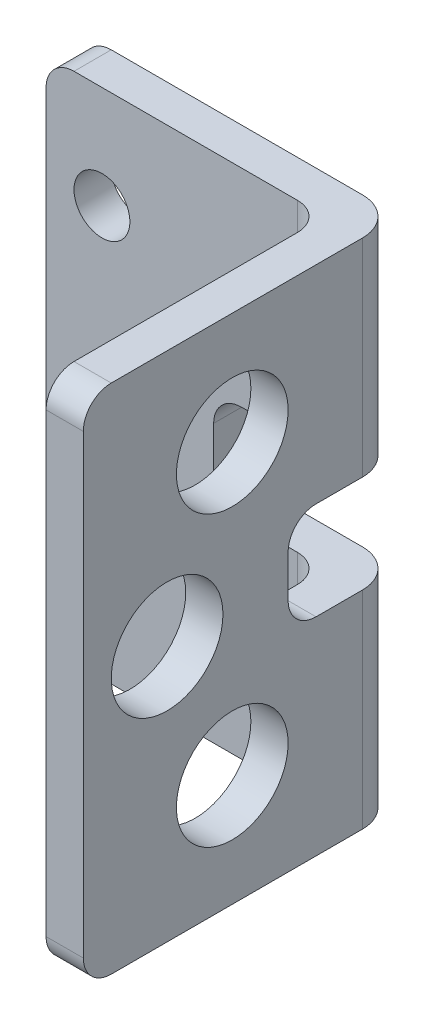
ISO-10303-21;
HEADER;
FILE_DESCRIPTION(('STEP AP214'),'2;1');
FILE_NAME('part.step','',(''),(''),'','','');
FILE_SCHEMA(('AUTOMOTIVE_DESIGN { 1 0 10303 214 1 1 1 1 }'));
ENDSEC;
DATA;
#1=APPLICATION_CONTEXT('core data for automotive mechanical design processes');
#2=APPLICATION_PROTOCOL_DEFINITION('international standard','automotive_design',2000,#1);
#3=PRODUCT_CONTEXT('',#1,'mechanical');
#4=PRODUCT('Part','Part','',(#3));
#5=PRODUCT_RELATED_PRODUCT_CATEGORY('part','',(#4));
#6=PRODUCT_DEFINITION_FORMATION('','',#4);
#7=PRODUCT_DEFINITION_CONTEXT('part definition',#1,'design');
#8=PRODUCT_DEFINITION('design','',#6,#7);
#9=PRODUCT_DEFINITION_SHAPE('','',#8);
#10=(LENGTH_UNIT() NAMED_UNIT(*) SI_UNIT(.MILLI.,.METRE.));
#11=(NAMED_UNIT(*) PLANE_ANGLE_UNIT() SI_UNIT($,.RADIAN.));
#12=(NAMED_UNIT(*) SI_UNIT($,.STERADIAN.) SOLID_ANGLE_UNIT());
#13=UNCERTAINTY_MEASURE_WITH_UNIT(LENGTH_MEASURE(1.E-05),#10,'distance_accuracy_value','');
#14=(GEOMETRIC_REPRESENTATION_CONTEXT(3) GLOBAL_UNCERTAINTY_ASSIGNED_CONTEXT((#13)) GLOBAL_UNIT_ASSIGNED_CONTEXT((#10,
#11,#12)) REPRESENTATION_CONTEXT('',''));
#15=CARTESIAN_POINT('',(0.,0.,0.));
#16=DIRECTION('',(0.,0.,1.));
#17=DIRECTION('',(1.,0.,0.));
#18=AXIS2_PLACEMENT_3D('',#15,#16,#17);
#19=CARTESIAN_POINT('',(15.,27.5,0.));
#20=DIRECTION('',(0.,-1.,0.));
#21=DIRECTION('',(0.,0.,-1.));
#22=AXIS2_PLACEMENT_3D('',#19,#20,#21);
#23=CYLINDRICAL_SURFACE('',#22,1.99999999999999);
#24=DIRECTION('',(0.,-1.,0.));
#25=VECTOR('',#24,1.);
#26=CARTESIAN_POINT('',(17.,27.5,0.));
#27=LINE('',#26,#25);
#28=CARTESIAN_POINT('',(17.,27.5,0.));
#29=VERTEX_POINT('',#28);
#30=CARTESIAN_POINT('',(17.,16.375,0.));
#31=VERTEX_POINT('',#30);
#32=EDGE_CURVE('E233',#29,#31,#27,.T.);
#33=ORIENTED_EDGE('',*,*,#32,.T.);
#34=CARTESIAN_POINT('',(15.,16.375,0.));
#35=DIRECTION('',(0.,1.,0.));
#36=DIRECTION('',(0.,0.,1.));
#37=AXIS2_PLACEMENT_3D('',#34,#35,#36);
#38=CIRCLE('',#37,1.99999999999999);
#39=CARTESIAN_POINT('',(15.,16.375,-2.));
#40=VERTEX_POINT('',#39);
#41=EDGE_CURVE('E346',#31,#40,#38,.T.);
#42=ORIENTED_EDGE('',*,*,#41,.T.);
#43=DIRECTION('',(0.,-1.,0.));
#44=VECTOR('',#43,1.);
#45=CARTESIAN_POINT('',(15.,27.5,-2.));
#46=LINE('',#45,#44);
#47=CARTESIAN_POINT('',(15.,27.5,-2.));
#48=VERTEX_POINT('',#47);
#49=EDGE_CURVE('E223',#48,#40,#46,.T.);
#50=ORIENTED_EDGE('',*,*,#49,.F.);
#51=CARTESIAN_POINT('',(15.,27.5,0.));
#52=DIRECTION('',(0.,1.,0.));
#53=DIRECTION('',(0.,0.,-1.));
#54=AXIS2_PLACEMENT_3D('',#51,#52,#53);
#55=CIRCLE('',#54,1.99999999999999);
#56=EDGE_CURVE('E390',#29,#48,#55,.T.);
#57=ORIENTED_EDGE('',*,*,#56,.F.);
#58=EDGE_LOOP('',(#33,#42,#50,#57));
#59=FACE_BOUND('',#58,.T.);
#60=ADVANCED_FACE('F36',(#59),#23,.T.);
#61=CARTESIAN_POINT('',(0.,27.5,0.));
#62=DIRECTION('',(1.,0.,0.));
#63=DIRECTION('',(0.,0.,-1.));
#64=AXIS2_PLACEMENT_3D('',#61,#62,#63);
#65=PLANE('',#64);
#66=DIRECTION('',(0.,-1.,0.));
#67=VECTOR('',#66,1.);
#68=CARTESIAN_POINT('',(0.,27.5,-2.));
#69=LINE('',#68,#67);
#70=CARTESIAN_POINT('',(0.,26.,-2.));
#71=VERTEX_POINT('',#70);
#72=CARTESIAN_POINT('',(0.,1.5,-2.));
#73=VERTEX_POINT('',#72);
#74=EDGE_CURVE('E224',#71,#73,#69,.T.);
#75=ORIENTED_EDGE('',*,*,#74,.T.);
#76=DIRECTION('',(0.,0.,1.));
#77=VECTOR('',#76,1.);
#78=CARTESIAN_POINT('',(0.,1.5,0.));
#79=LINE('',#78,#77);
#80=CARTESIAN_POINT('',(0.,1.5,0.));
#81=VERTEX_POINT('',#80);
#82=EDGE_CURVE('E278',#73,#81,#79,.T.);
#83=ORIENTED_EDGE('',*,*,#82,.T.);
#84=DIRECTION('',(0.,-1.,0.));
#85=VECTOR('',#84,1.);
#86=CARTESIAN_POINT('',(0.,27.5,0.));
#87=LINE('',#86,#85);
#88=CARTESIAN_POINT('',(0.,26.,0.));
#89=VERTEX_POINT('',#88);
#90=EDGE_CURVE('E242',#89,#81,#87,.T.);
#91=ORIENTED_EDGE('',*,*,#90,.F.);
#92=DIRECTION('',(0.,0.,1.));
#93=VECTOR('',#92,1.);
#94=CARTESIAN_POINT('',(0.,26.,0.));
#95=LINE('',#94,#93);
#96=EDGE_CURVE('E276',#89,#71,#95,.F.);
#97=ORIENTED_EDGE('',*,*,#96,.T.);
#98=EDGE_LOOP('',(#75,#83,#91,#97));
#99=FACE_BOUND('',#98,.T.);
#100=ADVANCED_FACE('F400',(#99),#65,.F.);
#101=CARTESIAN_POINT('',(0.,27.5,0.));
#102=DIRECTION('',(0.,0.,-1.));
#103=DIRECTION('',(-1.,0.,0.));
#104=AXIS2_PLACEMENT_3D('',#101,#102,#103);
#105=PLANE('',#104);
#106=CARTESIAN_POINT('',(3.,5.5,0.));
#107=DIRECTION('',(0.,0.,-1.));
#108=DIRECTION('',(-1.,0.,0.));
#109=AXIS2_PLACEMENT_3D('',#106,#107,#108);
#110=CIRCLE('',#109,1.5);
#111=CARTESIAN_POINT('',(1.5,5.5,0.));
#112=VERTEX_POINT('',#111);
#113=EDGE_CURVE('E543',#112,#112,#110,.T.);
#114=ORIENTED_EDGE('',*,*,#113,.T.);
#115=EDGE_LOOP('',(#114));
#116=FACE_BOUND('',#115,.T.);
#117=CARTESIAN_POINT('',(3.,22.,0.));
#118=DIRECTION('',(0.,0.,-1.));
#119=DIRECTION('',(-1.,0.,0.));
#120=AXIS2_PLACEMENT_3D('',#117,#118,#119);
#121=CIRCLE('',#120,1.5);
#122=CARTESIAN_POINT('',(1.5,22.,0.));
#123=VERTEX_POINT('',#122);
#124=EDGE_CURVE('E547',#123,#123,#121,.T.);
#125=ORIENTED_EDGE('',*,*,#124,.T.);
#126=EDGE_LOOP('',(#125));
#127=FACE_BOUND('',#126,.T.);
#128=DIRECTION('',(1.,0.,0.));
#129=VECTOR('',#128,1.);
#130=CARTESIAN_POINT('',(0.,16.375,0.));
#131=LINE('',#130,#129);
#132=CARTESIAN_POINT('',(10.5,16.375,0.));
#133=VERTEX_POINT('',#132);
#134=CARTESIAN_POINT('',(13.5,16.375,0.));
#135=VERTEX_POINT('',#134);
#136=EDGE_CURVE('E432',#133,#135,#131,.T.);
#137=ORIENTED_EDGE('',*,*,#136,.T.);
#138=DIRECTION('',(0.,-1.,0.));
#139=VECTOR('',#138,1.);
#140=CARTESIAN_POINT('',(13.5,27.5,0.));
#141=LINE('',#140,#139);
#142=CARTESIAN_POINT('',(13.5,27.5,0.));
#143=VERTEX_POINT('',#142);
#144=EDGE_CURVE('E261',#135,#143,#141,.F.);
#145=ORIENTED_EDGE('',*,*,#144,.T.);
#146=DIRECTION('',(1.,0.,0.));
#147=VECTOR('',#146,1.);
#148=CARTESIAN_POINT('',(0.,27.5,0.));
#149=LINE('',#148,#147);
#150=CARTESIAN_POINT('',(1.5,27.5,0.));
#151=VERTEX_POINT('',#150);
#152=EDGE_CURVE('E375',#151,#143,#149,.T.);
#153=ORIENTED_EDGE('',*,*,#152,.F.);
#154=CARTESIAN_POINT('',(1.5,26.,0.));
#155=DIRECTION('',(0.,0.,-1.));
#156=DIRECTION('',(-1.,0.,0.));
#157=AXIS2_PLACEMENT_3D('',#154,#155,#156);
#158=CIRCLE('',#157,1.5);
#159=EDGE_CURVE('E255',#151,#89,#158,.F.);
#160=ORIENTED_EDGE('',*,*,#159,.T.);
#161=ORIENTED_EDGE('',*,*,#90,.T.);
#162=CARTESIAN_POINT('',(1.5,1.5,0.));
#163=DIRECTION('',(0.,0.,-1.));
#164=DIRECTION('',(-1.,0.,0.));
#165=AXIS2_PLACEMENT_3D('',#162,#163,#164);
#166=CIRCLE('',#165,1.5);
#167=CARTESIAN_POINT('',(1.5,0.,0.));
#168=VERTEX_POINT('',#167);
#169=EDGE_CURVE('E257',#81,#168,#166,.F.);
#170=ORIENTED_EDGE('',*,*,#169,.T.);
#171=DIRECTION('',(1.,0.,0.));
#172=VECTOR('',#171,1.);
#173=CARTESIAN_POINT('',(0.,0.,0.));
#174=LINE('',#173,#172);
#175=CARTESIAN_POINT('',(13.5,0.,0.));
#176=VERTEX_POINT('',#175);
#177=EDGE_CURVE('E367',#168,#176,#174,.T.);
#178=ORIENTED_EDGE('',*,*,#177,.T.);
#179=DIRECTION('',(0.,-1.,0.));
#180=VECTOR('',#179,1.);
#181=CARTESIAN_POINT('',(13.5,11.125,0.));
#182=LINE('',#181,#180);
#183=CARTESIAN_POINT('',(13.5,11.125,0.));
#184=VERTEX_POINT('',#183);
#185=EDGE_CURVE('E259',#176,#184,#182,.F.);
#186=ORIENTED_EDGE('',*,*,#185,.T.);
#187=DIRECTION('',(-1.,0.,0.));
#188=VECTOR('',#187,1.);
#189=CARTESIAN_POINT('',(0.,11.125,0.));
#190=LINE('',#189,#188);
#191=CARTESIAN_POINT('',(10.5,11.125,0.));
#192=VERTEX_POINT('',#191);
#193=EDGE_CURVE('E335',#184,#192,#190,.T.);
#194=ORIENTED_EDGE('',*,*,#193,.T.);
#195=CARTESIAN_POINT('',(10.5,12.625,0.));
#196=DIRECTION('',(0.,0.,-1.));
#197=DIRECTION('',(-1.,0.,0.));
#198=AXIS2_PLACEMENT_3D('',#195,#196,#197);
#199=CIRCLE('',#198,1.5);
#200=CARTESIAN_POINT('',(9.,12.625,0.));
#201=VERTEX_POINT('',#200);
#202=EDGE_CURVE('E44',#192,#201,#199,.T.);
#203=ORIENTED_EDGE('',*,*,#202,.T.);
#204=DIRECTION('',(0.,-1.,0.));
#205=VECTOR('',#204,1.);
#206=CARTESIAN_POINT('',(9.,27.5,0.));
#207=LINE('',#206,#205);
#208=CARTESIAN_POINT('',(9.,14.875,0.));
#209=VERTEX_POINT('',#208);
#210=EDGE_CURVE('E217',#209,#201,#207,.T.);
#211=ORIENTED_EDGE('',*,*,#210,.F.);
#212=CARTESIAN_POINT('',(10.5,14.875,0.));
#213=DIRECTION('',(0.,0.,-1.));
#214=DIRECTION('',(-1.,0.,0.));
#215=AXIS2_PLACEMENT_3D('',#212,#213,#214);
#216=CIRCLE('',#215,1.5);
#217=EDGE_CURVE('E322',#209,#133,#216,.T.);
#218=ORIENTED_EDGE('',*,*,#217,.T.);
#219=EDGE_LOOP('',(#137,#145,#153,#160,#161,#170,#178,#186,#194,#203,#211,#218));
#220=FACE_BOUND('',#219,.T.);
#221=ADVANCED_FACE('F332',(#116,#127,#220),#105,.F.);
#222=CARTESIAN_POINT('',(15.,27.5,0.));
#223=DIRECTION('',(1.,0.,0.));
#224=DIRECTION('',(0.,0.,-1.));
#225=AXIS2_PLACEMENT_3D('',#222,#223,#224);
#226=PLANE('',#225);
#227=DIRECTION('',(0.,0.,1.));
#228=VECTOR('',#227,1.);
#229=CARTESIAN_POINT('',(15.,27.5,0.));
#230=LINE('',#229,#228);
#231=CARTESIAN_POINT('',(15.,27.5,1.5));
#232=VERTEX_POINT('',#231);
#233=CARTESIAN_POINT('',(15.,27.5,13.5));
#234=VERTEX_POINT('',#233);
#235=EDGE_CURVE('E378',#232,#234,#230,.T.);
#236=ORIENTED_EDGE('',*,*,#235,.F.);
#237=DIRECTION('',(0.,-1.,0.));
#238=VECTOR('',#237,1.);
#239=CARTESIAN_POINT('',(15.,16.375,1.5));
#240=LINE('',#239,#238);
#241=CARTESIAN_POINT('',(15.,16.375,1.5));
#242=VERTEX_POINT('',#241);
#243=EDGE_CURVE('E252',#232,#242,#240,.T.);
#244=ORIENTED_EDGE('',*,*,#243,.T.);
#245=DIRECTION('',(0.,0.,1.));
#246=VECTOR('',#245,1.);
#247=CARTESIAN_POINT('',(15.,16.375,0.));
#248=LINE('',#247,#246);
#249=CARTESIAN_POINT('',(15.,16.375,2.5));
#250=VERTEX_POINT('',#249);
#251=EDGE_CURVE('E425',#242,#250,#248,.T.);
#252=ORIENTED_EDGE('',*,*,#251,.T.);
#253=CARTESIAN_POINT('',(15.,14.875,2.5));
#254=DIRECTION('',(1.,0.,0.));
#255=DIRECTION('',(0.,0.,-1.));
#256=AXIS2_PLACEMENT_3D('',#253,#254,#255);
#257=CIRCLE('',#256,1.5);
#258=CARTESIAN_POINT('',(15.,14.875,4.));
#259=VERTEX_POINT('',#258);
#260=EDGE_CURVE('E318',#250,#259,#257,.T.);
#261=ORIENTED_EDGE('',*,*,#260,.T.);
#262=DIRECTION('',(0.,-1.,0.));
#263=VECTOR('',#262,1.);
#264=CARTESIAN_POINT('',(15.,27.5,4.));
#265=LINE('',#264,#263);
#266=CARTESIAN_POINT('',(15.,12.625,4.));
#267=VERTEX_POINT('',#266);
#268=EDGE_CURVE('E434',#259,#267,#265,.T.);
#269=ORIENTED_EDGE('',*,*,#268,.T.);
#270=CARTESIAN_POINT('',(15.,12.625,2.5));
#271=DIRECTION('',(1.,0.,0.));
#272=DIRECTION('',(0.,0.,-1.));
#273=AXIS2_PLACEMENT_3D('',#270,#271,#272);
#274=CIRCLE('',#273,1.5);
#275=CARTESIAN_POINT('',(15.,11.125,2.5));
#276=VERTEX_POINT('',#275);
#277=EDGE_CURVE('E326',#267,#276,#274,.T.);
#278=ORIENTED_EDGE('',*,*,#277,.T.);
#279=DIRECTION('',(0.,0.,-1.));
#280=VECTOR('',#279,1.);
#281=CARTESIAN_POINT('',(15.,11.125,0.));
#282=LINE('',#281,#280);
#283=CARTESIAN_POINT('',(15.,11.125,1.5));
#284=VERTEX_POINT('',#283);
#285=EDGE_CURVE('E216',#276,#284,#282,.T.);
#286=ORIENTED_EDGE('',*,*,#285,.T.);
#287=DIRECTION('',(0.,-1.,0.));
#288=VECTOR('',#287,1.);
#289=CARTESIAN_POINT('',(15.,0.,1.5));
#290=LINE('',#289,#288);
#291=CARTESIAN_POINT('',(15.,0.,1.5));
#292=VERTEX_POINT('',#291);
#293=EDGE_CURVE('E249',#284,#292,#290,.T.);
#294=ORIENTED_EDGE('',*,*,#293,.T.);
#295=DIRECTION('',(0.,0.,1.));
#296=VECTOR('',#295,1.);
#297=CARTESIAN_POINT('',(15.,0.,0.));
#298=LINE('',#297,#296);
#299=CARTESIAN_POINT('',(15.,0.,13.5));
#300=VERTEX_POINT('',#299);
#301=EDGE_CURVE('E358',#292,#300,#298,.T.);
#302=ORIENTED_EDGE('',*,*,#301,.T.);
#303=CARTESIAN_POINT('',(15.,1.5,13.5));
#304=DIRECTION('',(1.,0.,0.));
#305=DIRECTION('',(0.,0.,-1.));
#306=AXIS2_PLACEMENT_3D('',#303,#304,#305);
#307=CIRCLE('',#306,1.5);
#308=CARTESIAN_POINT('',(15.,1.5,15.));
#309=VERTEX_POINT('',#308);
#310=EDGE_CURVE('E247',#300,#309,#307,.F.);
#311=ORIENTED_EDGE('',*,*,#310,.T.);
#312=DIRECTION('',(0.,-1.,0.));
#313=VECTOR('',#312,1.);
#314=CARTESIAN_POINT('',(15.,27.5,15.));
#315=LINE('',#314,#313);
#316=CARTESIAN_POINT('',(15.,26.,15.));
#317=VERTEX_POINT('',#316);
#318=EDGE_CURVE('E239',#317,#309,#315,.T.);
#319=ORIENTED_EDGE('',*,*,#318,.F.);
#320=CARTESIAN_POINT('',(15.,26.,13.5));
#321=DIRECTION('',(1.,0.,0.));
#322=DIRECTION('',(0.,0.,-1.));
#323=AXIS2_PLACEMENT_3D('',#320,#321,#322);
#324=CIRCLE('',#323,1.5);
#325=EDGE_CURVE('E245',#317,#234,#324,.F.);
#326=ORIENTED_EDGE('',*,*,#325,.T.);
#327=EDGE_LOOP('',(#236,#244,#252,#261,#269,#278,#286,#294,#302,#311,#319,#326));
#328=FACE_BOUND('',#327,.T.);
#329=CARTESIAN_POINT('',(15.,6.,7.));
#330=DIRECTION('',(1.,0.,0.));
#331=DIRECTION('',(0.,0.,-1.));
#332=AXIS2_PLACEMENT_3D('',#329,#330,#331);
#333=CIRCLE('',#332,3.);
#334=CARTESIAN_POINT('',(15.,6.,4.));
#335=VERTEX_POINT('',#334);
#336=EDGE_CURVE('E370',#335,#335,#333,.T.);
#337=ORIENTED_EDGE('',*,*,#336,.T.);
#338=EDGE_LOOP('',(#337));
#339=FACE_BOUND('',#338,.T.);
#340=CARTESIAN_POINT('',(15.,13.75,10.5));
#341=DIRECTION('',(1.,0.,0.));
#342=DIRECTION('',(0.,0.,-1.));
#343=AXIS2_PLACEMENT_3D('',#340,#341,#342);
#344=CIRCLE('',#343,3.);
#345=CARTESIAN_POINT('',(15.,13.75,7.5));
#346=VERTEX_POINT('',#345);
#347=EDGE_CURVE('E452',#346,#346,#344,.T.);
#348=ORIENTED_EDGE('',*,*,#347,.T.);
#349=EDGE_LOOP('',(#348));
#350=FACE_BOUND('',#349,.T.);
#351=CARTESIAN_POINT('',(15.,21.5,7.));
#352=DIRECTION('',(1.,0.,0.));
#353=DIRECTION('',(0.,0.,-1.));
#354=AXIS2_PLACEMENT_3D('',#351,#352,#353);
#355=CIRCLE('',#354,3.);
#356=CARTESIAN_POINT('',(15.,21.5,4.));
#357=VERTEX_POINT('',#356);
#358=EDGE_CURVE('E445',#357,#357,#355,.T.);
#359=ORIENTED_EDGE('',*,*,#358,.T.);
#360=EDGE_LOOP('',(#359));
#361=FACE_BOUND('',#360,.T.);
#362=ADVANCED_FACE('F356',(#328,#339,#350,#361),#226,.F.);
#363=CARTESIAN_POINT('',(15.,27.5,15.));
#364=DIRECTION('',(0.,0.,-1.));
#365=DIRECTION('',(-1.,0.,0.));
#366=AXIS2_PLACEMENT_3D('',#363,#364,#365);
#367=PLANE('',#366);
#368=ORIENTED_EDGE('',*,*,#318,.T.);
#369=DIRECTION('',(1.,0.,0.));
#370=VECTOR('',#369,1.);
#371=CARTESIAN_POINT('',(17.,1.5,15.));
#372=LINE('',#371,#370);
#373=CARTESIAN_POINT('',(17.,1.5,15.));
#374=VERTEX_POINT('',#373);
#375=EDGE_CURVE('E265',#309,#374,#372,.T.);
#376=ORIENTED_EDGE('',*,*,#375,.T.);
#377=DIRECTION('',(0.,-1.,0.));
#378=VECTOR('',#377,1.);
#379=CARTESIAN_POINT('',(17.,27.5,15.));
#380=LINE('',#379,#378);
#381=CARTESIAN_POINT('',(17.,26.,15.));
#382=VERTEX_POINT('',#381);
#383=EDGE_CURVE('E236',#382,#374,#380,.T.);
#384=ORIENTED_EDGE('',*,*,#383,.F.);
#385=DIRECTION('',(1.,0.,0.));
#386=VECTOR('',#385,1.);
#387=CARTESIAN_POINT('',(15.,26.,15.));
#388=LINE('',#387,#386);
#389=EDGE_CURVE('E263',#382,#317,#388,.F.);
#390=ORIENTED_EDGE('',*,*,#389,.T.);
#391=EDGE_LOOP('',(#368,#376,#384,#390));
#392=FACE_BOUND('',#391,.T.);
#393=ADVANCED_FACE('F412',(#392),#367,.F.);
#394=CARTESIAN_POINT('',(17.,27.5,0.));
#395=DIRECTION('',(-1.,0.,0.));
#396=DIRECTION('',(0.,0.,1.));
#397=AXIS2_PLACEMENT_3D('',#394,#395,#396);
#398=PLANE('',#397);
#399=CARTESIAN_POINT('',(17.,6.,7.));
#400=DIRECTION('',(1.,0.,0.));
#401=DIRECTION('',(0.,0.,-1.));
#402=AXIS2_PLACEMENT_3D('',#399,#400,#401);
#403=CIRCLE('',#402,3.);
#404=CARTESIAN_POINT('',(17.,6.,4.));
#405=VERTEX_POINT('',#404);
#406=EDGE_CURVE('E442',#405,#405,#403,.T.);
#407=ORIENTED_EDGE('',*,*,#406,.F.);
#408=EDGE_LOOP('',(#407));
#409=FACE_BOUND('',#408,.T.);
#410=CARTESIAN_POINT('',(17.,13.75,10.5));
#411=DIRECTION('',(1.,0.,0.));
#412=DIRECTION('',(0.,0.,-1.));
#413=AXIS2_PLACEMENT_3D('',#410,#411,#412);
#414=CIRCLE('',#413,3.);
#415=CARTESIAN_POINT('',(17.,13.75,7.5));
#416=VERTEX_POINT('',#415);
#417=EDGE_CURVE('E446',#416,#416,#414,.T.);
#418=ORIENTED_EDGE('',*,*,#417,.F.);
#419=EDGE_LOOP('',(#418));
#420=FACE_BOUND('',#419,.T.);
#421=CARTESIAN_POINT('',(17.,21.5,7.));
#422=DIRECTION('',(1.,0.,0.));
#423=DIRECTION('',(0.,0.,-1.));
#424=AXIS2_PLACEMENT_3D('',#421,#422,#423);
#425=CIRCLE('',#424,3.);
#426=CARTESIAN_POINT('',(17.,21.5,4.));
#427=VERTEX_POINT('',#426);
#428=EDGE_CURVE('E441',#427,#427,#425,.T.);
#429=ORIENTED_EDGE('',*,*,#428,.F.);
#430=EDGE_LOOP('',(#429));
#431=FACE_BOUND('',#430,.T.);
#432=ORIENTED_EDGE('',*,*,#383,.T.);
#433=CARTESIAN_POINT('',(17.,1.5,13.5));
#434=DIRECTION('',(-1.,0.,0.));
#435=DIRECTION('',(0.,0.,1.));
#436=AXIS2_PLACEMENT_3D('',#433,#434,#435);
#437=CIRCLE('',#436,1.5);
#438=CARTESIAN_POINT('',(17.,0.,13.5));
#439=VERTEX_POINT('',#438);
#440=EDGE_CURVE('E270',#374,#439,#437,.F.);
#441=ORIENTED_EDGE('',*,*,#440,.T.);
#442=DIRECTION('',(0.,0.,-1.));
#443=VECTOR('',#442,1.);
#444=CARTESIAN_POINT('',(17.,0.,0.));
#445=LINE('',#444,#443);
#446=CARTESIAN_POINT('',(17.,0.,0.));
#447=VERTEX_POINT('',#446);
#448=EDGE_CURVE('E366',#439,#447,#445,.T.);
#449=ORIENTED_EDGE('',*,*,#448,.T.);
#450=CARTESIAN_POINT('',(17.,11.125,0.));
#451=VERTEX_POINT('',#450);
#452=EDGE_CURVE('E227',#451,#447,#27,.T.);
#453=ORIENTED_EDGE('',*,*,#452,.F.);
#454=DIRECTION('',(0.,0.,-1.));
#455=VECTOR('',#454,1.);
#456=CARTESIAN_POINT('',(17.,11.125,4.));
#457=LINE('',#456,#455);
#458=CARTESIAN_POINT('',(17.,11.125,2.5));
#459=VERTEX_POINT('',#458);
#460=EDGE_CURVE('E205',#459,#451,#457,.T.);
#461=ORIENTED_EDGE('',*,*,#460,.F.);
#462=CARTESIAN_POINT('',(17.,12.625,2.5));
#463=DIRECTION('',(-1.,0.,0.));
#464=DIRECTION('',(0.,0.,1.));
#465=AXIS2_PLACEMENT_3D('',#462,#463,#464);
#466=CIRCLE('',#465,1.5);
#467=CARTESIAN_POINT('',(17.,12.625,4.));
#468=VERTEX_POINT('',#467);
#469=EDGE_CURVE('E324',#459,#468,#466,.T.);
#470=ORIENTED_EDGE('',*,*,#469,.T.);
#471=DIRECTION('',(0.,-1.,0.));
#472=VECTOR('',#471,1.);
#473=CARTESIAN_POINT('',(17.,11.125,4.));
#474=LINE('',#473,#472);
#475=CARTESIAN_POINT('',(17.,14.875,4.));
#476=VERTEX_POINT('',#475);
#477=EDGE_CURVE('E538',#476,#468,#474,.T.);
#478=ORIENTED_EDGE('',*,*,#477,.F.);
#479=CARTESIAN_POINT('',(17.,14.875,2.5));
#480=DIRECTION('',(-1.,0.,0.));
#481=DIRECTION('',(0.,0.,1.));
#482=AXIS2_PLACEMENT_3D('',#479,#480,#481);
#483=CIRCLE('',#482,1.5);
#484=CARTESIAN_POINT('',(17.,16.375,2.5));
#485=VERTEX_POINT('',#484);
#486=EDGE_CURVE('E316',#476,#485,#483,.T.);
#487=ORIENTED_EDGE('',*,*,#486,.T.);
#488=DIRECTION('',(0.,0.,1.));
#489=VECTOR('',#488,1.);
#490=CARTESIAN_POINT('',(17.,16.375,4.));
#491=LINE('',#490,#489);
#492=EDGE_CURVE('E541',#31,#485,#491,.T.);
#493=ORIENTED_EDGE('',*,*,#492,.F.);
#494=ORIENTED_EDGE('',*,*,#32,.F.);
#495=DIRECTION('',(0.,0.,-1.));
#496=VECTOR('',#495,1.);
#497=CARTESIAN_POINT('',(17.,27.5,0.));
#498=LINE('',#497,#496);
#499=CARTESIAN_POINT('',(17.,27.5,13.5));
#500=VERTEX_POINT('',#499);
#501=EDGE_CURVE('E384',#500,#29,#498,.T.);
#502=ORIENTED_EDGE('',*,*,#501,.F.);
#503=CARTESIAN_POINT('',(17.,26.,13.5));
#504=DIRECTION('',(-1.,0.,0.));
#505=DIRECTION('',(0.,0.,1.));
#506=AXIS2_PLACEMENT_3D('',#503,#504,#505);
#507=CIRCLE('',#506,1.5);
#508=EDGE_CURVE('E268',#500,#382,#507,.F.);
#509=ORIENTED_EDGE('',*,*,#508,.T.);
#510=EDGE_LOOP('',(#432,#441,#449,#453,#461,#470,#478,#487,#493,#494,#502,#509));
#511=FACE_BOUND('',#510,.T.);
#512=ADVANCED_FACE('F485',(#409,#420,#431,#511),#398,.F.);
#513=CARTESIAN_POINT('',(15.,11.125,-2.));
#514=VERTEX_POINT('',#513);
#515=CARTESIAN_POINT('',(15.,0.,-2.));
#516=VERTEX_POINT('',#515);
#517=EDGE_CURVE('E199',#514,#516,#46,.T.);
#518=ORIENTED_EDGE('',*,*,#517,.F.);
#519=CARTESIAN_POINT('',(15.,11.125,0.));
#520=DIRECTION('',(0.,-1.,0.));
#521=DIRECTION('',(0.,0.,-1.));
#522=AXIS2_PLACEMENT_3D('',#519,#520,#521);
#523=CIRCLE('',#522,1.99999999999999);
#524=EDGE_CURVE('E208',#514,#451,#523,.T.);
#525=ORIENTED_EDGE('',*,*,#524,.T.);
#526=ORIENTED_EDGE('',*,*,#452,.T.);
#527=CARTESIAN_POINT('',(15.,0.,0.));
#528=DIRECTION('',(0.,1.,0.));
#529=DIRECTION('',(0.,0.,-1.));
#530=AXIS2_PLACEMENT_3D('',#527,#528,#529);
#531=CIRCLE('',#530,1.99999999999999);
#532=EDGE_CURVE('E221',#447,#516,#531,.T.);
#533=ORIENTED_EDGE('',*,*,#532,.T.);
#534=EDGE_LOOP('',(#518,#525,#526,#533));
#535=FACE_BOUND('',#534,.T.);
#536=ADVANCED_FACE('F219',(#535),#23,.T.);
#537=CARTESIAN_POINT('',(0.,27.5,-2.));
#538=DIRECTION('',(0.,0.,1.));
#539=DIRECTION('',(1.,0.,0.));
#540=AXIS2_PLACEMENT_3D('',#537,#538,#539);
#541=PLANE('',#540);
#542=CARTESIAN_POINT('',(3.,5.5,-2.));
#543=DIRECTION('',(0.,0.,-1.));
#544=DIRECTION('',(-1.,0.,0.));
#545=AXIS2_PLACEMENT_3D('',#542,#543,#544);
#546=CIRCLE('',#545,1.5);
#547=CARTESIAN_POINT('',(1.5,5.5,-2.));
#548=VERTEX_POINT('',#547);
#549=EDGE_CURVE('E550',#548,#548,#546,.T.);
#550=ORIENTED_EDGE('',*,*,#549,.F.);
#551=EDGE_LOOP('',(#550));
#552=FACE_BOUND('',#551,.T.);
#553=CARTESIAN_POINT('',(3.,22.,-2.));
#554=DIRECTION('',(0.,0.,-1.));
#555=DIRECTION('',(1.,0.,0.));
#556=AXIS2_PLACEMENT_3D('',#553,#554,#555);
#557=CIRCLE('',#556,1.5);
#558=CARTESIAN_POINT('',(4.5,22.,-2.));
#559=VERTEX_POINT('',#558);
#560=EDGE_CURVE('E551',#559,#559,#557,.T.);
#561=ORIENTED_EDGE('',*,*,#560,.F.);
#562=EDGE_LOOP('',(#561));
#563=FACE_BOUND('',#562,.T.);
#564=DIRECTION('',(-1.,0.,0.));
#565=VECTOR('',#564,1.);
#566=CARTESIAN_POINT('',(0.,0.,-2.));
#567=LINE('',#566,#565);
#568=CARTESIAN_POINT('',(1.5,0.,-2.));
#569=VERTEX_POINT('',#568);
#570=EDGE_CURVE('E374',#516,#569,#567,.T.);
#571=ORIENTED_EDGE('',*,*,#570,.T.);
#572=CARTESIAN_POINT('',(1.5,1.5,-2.));
#573=DIRECTION('',(0.,0.,1.));
#574=DIRECTION('',(1.,0.,0.));
#575=AXIS2_PLACEMENT_3D('',#572,#573,#574);
#576=CIRCLE('',#575,1.5);
#577=EDGE_CURVE('E282',#569,#73,#576,.F.);
#578=ORIENTED_EDGE('',*,*,#577,.T.);
#579=ORIENTED_EDGE('',*,*,#74,.F.);
#580=CARTESIAN_POINT('',(1.5,26.,-2.));
#581=DIRECTION('',(0.,0.,1.));
#582=DIRECTION('',(1.,0.,0.));
#583=AXIS2_PLACEMENT_3D('',#580,#581,#582);
#584=CIRCLE('',#583,1.5);
#585=CARTESIAN_POINT('',(1.5,27.5,-2.));
#586=VERTEX_POINT('',#585);
#587=EDGE_CURVE('E51',#71,#586,#584,.F.);
#588=ORIENTED_EDGE('',*,*,#587,.T.);
#589=DIRECTION('',(-1.,0.,0.));
#590=VECTOR('',#589,1.);
#591=CARTESIAN_POINT('',(0.,27.5,-2.));
#592=LINE('',#591,#590);
#593=EDGE_CURVE('E229',#48,#586,#592,.T.);
#594=ORIENTED_EDGE('',*,*,#593,.F.);
#595=ORIENTED_EDGE('',*,*,#49,.T.);
#596=DIRECTION('',(1.,0.,0.));
#597=VECTOR('',#596,1.);
#598=CARTESIAN_POINT('',(-7.97260935955099,16.375,-2.));
#599=LINE('',#598,#597);
#600=CARTESIAN_POINT('',(10.5,16.375,-2.));
#601=VERTEX_POINT('',#600);
#602=EDGE_CURVE('E204',#601,#40,#599,.T.);
#603=ORIENTED_EDGE('',*,*,#602,.F.);
#604=CARTESIAN_POINT('',(10.5,14.875,-2.));
#605=DIRECTION('',(0.,0.,1.));
#606=DIRECTION('',(1.,0.,0.));
#607=AXIS2_PLACEMENT_3D('',#604,#605,#606);
#608=CIRCLE('',#607,1.5);
#609=CARTESIAN_POINT('',(9.,14.875,-2.));
#610=VERTEX_POINT('',#609);
#611=EDGE_CURVE('E320',#601,#610,#608,.T.);
#612=ORIENTED_EDGE('',*,*,#611,.T.);
#613=DIRECTION('',(0.,-1.,0.));
#614=VECTOR('',#613,1.);
#615=CARTESIAN_POINT('',(9.,16.375,-2.));
#616=LINE('',#615,#614);
#617=CARTESIAN_POINT('',(9.,12.625,-2.));
#618=VERTEX_POINT('',#617);
#619=EDGE_CURVE('E342',#610,#618,#616,.T.);
#620=ORIENTED_EDGE('',*,*,#619,.T.);
#621=CARTESIAN_POINT('',(10.5,12.625,-2.));
#622=DIRECTION('',(0.,0.,1.));
#623=DIRECTION('',(1.,0.,0.));
#624=AXIS2_PLACEMENT_3D('',#621,#622,#623);
#625=CIRCLE('',#624,1.5);
#626=CARTESIAN_POINT('',(10.5,11.125,-2.));
#627=VERTEX_POINT('',#626);
#628=EDGE_CURVE('E12',#618,#627,#625,.T.);
#629=ORIENTED_EDGE('',*,*,#628,.T.);
#630=DIRECTION('',(1.,0.,0.));
#631=VECTOR('',#630,1.);
#632=CARTESIAN_POINT('',(-7.97260935955099,11.125,-2.));
#633=LINE('',#632,#631);
#634=EDGE_CURVE('E194',#627,#514,#633,.T.);
#635=ORIENTED_EDGE('',*,*,#634,.T.);
#636=ORIENTED_EDGE('',*,*,#517,.T.);
#637=EDGE_LOOP('',(#571,#578,#579,#588,#594,#595,#603,#612,#620,#629,#635,#636));
#638=FACE_BOUND('',#637,.T.);
#639=ADVANCED_FACE('F197',(#552,#563,#638),#541,.F.);
#640=CARTESIAN_POINT('',(15.,27.5,0.));
#641=DIRECTION('',(0.,-1.,0.));
#642=DIRECTION('',(0.,0.,-1.));
#643=AXIS2_PLACEMENT_3D('',#640,#641,#642);
#644=PLANE('',#643);
#645=ORIENTED_EDGE('',*,*,#593,.T.);
#646=DIRECTION('',(0.,0.,1.));
#647=VECTOR('',#646,1.);
#648=CARTESIAN_POINT('',(1.5,27.5,0.));
#649=LINE('',#648,#647);
#650=EDGE_CURVE('E287',#586,#151,#649,.T.);
#651=ORIENTED_EDGE('',*,*,#650,.T.);
#652=ORIENTED_EDGE('',*,*,#152,.T.);
#653=CARTESIAN_POINT('',(13.5,27.5,1.5));
#654=DIRECTION('',(0.,-1.,0.));
#655=DIRECTION('',(0.,0.,-1.));
#656=AXIS2_PLACEMENT_3D('',#653,#654,#655);
#657=CIRCLE('',#656,1.5);
#658=EDGE_CURVE('E310',#143,#232,#657,.T.);
#659=ORIENTED_EDGE('',*,*,#658,.T.);
#660=ORIENTED_EDGE('',*,*,#235,.T.);
#661=DIRECTION('',(1.,0.,0.));
#662=VECTOR('',#661,1.);
#663=CARTESIAN_POINT('',(15.,27.5,13.5));
#664=LINE('',#663,#662);
#665=EDGE_CURVE('E284',#234,#500,#664,.T.);
#666=ORIENTED_EDGE('',*,*,#665,.T.);
#667=ORIENTED_EDGE('',*,*,#501,.T.);
#668=ORIENTED_EDGE('',*,*,#56,.T.);
#669=EDGE_LOOP('',(#645,#651,#652,#659,#660,#666,#667,#668));
#670=FACE_BOUND('',#669,.T.);
#671=ADVANCED_FACE('F392',(#670),#644,.F.);
#672=CARTESIAN_POINT('',(15.,0.,0.));
#673=DIRECTION('',(0.,-1.,0.));
#674=DIRECTION('',(0.,0.,-1.));
#675=AXIS2_PLACEMENT_3D('',#672,#673,#674);
#676=PLANE('',#675);
#677=ORIENTED_EDGE('',*,*,#448,.F.);
#678=DIRECTION('',(1.,0.,0.));
#679=VECTOR('',#678,1.);
#680=CARTESIAN_POINT('',(15.,0.,13.5));
#681=LINE('',#680,#679);
#682=EDGE_CURVE('E274',#439,#300,#681,.F.);
#683=ORIENTED_EDGE('',*,*,#682,.T.);
#684=ORIENTED_EDGE('',*,*,#301,.F.);
#685=CARTESIAN_POINT('',(13.5,0.,1.5));
#686=DIRECTION('',(0.,-1.,0.));
#687=DIRECTION('',(0.,0.,-1.));
#688=AXIS2_PLACEMENT_3D('',#685,#686,#687);
#689=CIRCLE('',#688,1.5);
#690=EDGE_CURVE('E312',#292,#176,#689,.F.);
#691=ORIENTED_EDGE('',*,*,#690,.T.);
#692=ORIENTED_EDGE('',*,*,#177,.F.);
#693=DIRECTION('',(0.,0.,1.));
#694=VECTOR('',#693,1.);
#695=CARTESIAN_POINT('',(1.5,0.,-2.));
#696=LINE('',#695,#694);
#697=EDGE_CURVE('E272',#168,#569,#696,.F.);
#698=ORIENTED_EDGE('',*,*,#697,.T.);
#699=ORIENTED_EDGE('',*,*,#570,.F.);
#700=ORIENTED_EDGE('',*,*,#532,.F.);
#701=EDGE_LOOP('',(#677,#683,#684,#691,#692,#698,#699,#700));
#702=FACE_BOUND('',#701,.T.);
#703=ADVANCED_FACE('F362',(#702),#676,.T.);
#704=CARTESIAN_POINT('',(-10.5,21.5,7.));
#705=DIRECTION('',(1.,0.,0.));
#706=DIRECTION('',(0.,0.,-1.));
#707=AXIS2_PLACEMENT_3D('',#704,#705,#706);
#708=CYLINDRICAL_SURFACE('',#707,3.);
#709=ORIENTED_EDGE('',*,*,#428,.T.);
#710=EDGE_LOOP('',(#709));
#711=FACE_BOUND('',#710,.T.);
#712=ORIENTED_EDGE('',*,*,#358,.F.);
#713=EDGE_LOOP('',(#712));
#714=FACE_BOUND('',#713,.T.);
#715=ADVANCED_FACE('F471',(#711,#714),#708,.F.);
#716=CARTESIAN_POINT('',(-10.5,13.75,10.5));
#717=DIRECTION('',(1.,0.,0.));
#718=DIRECTION('',(0.,0.,-1.));
#719=AXIS2_PLACEMENT_3D('',#716,#717,#718);
#720=CYLINDRICAL_SURFACE('',#719,3.);
#721=ORIENTED_EDGE('',*,*,#417,.T.);
#722=EDGE_LOOP('',(#721));
#723=FACE_BOUND('',#722,.T.);
#724=ORIENTED_EDGE('',*,*,#347,.F.);
#725=EDGE_LOOP('',(#724));
#726=FACE_BOUND('',#725,.T.);
#727=ADVANCED_FACE('F462',(#723,#726),#720,.F.);
#728=CARTESIAN_POINT('',(-10.5,6.,7.));
#729=DIRECTION('',(1.,0.,0.));
#730=DIRECTION('',(0.,0.,-1.));
#731=AXIS2_PLACEMENT_3D('',#728,#729,#730);
#732=CYLINDRICAL_SURFACE('',#731,3.);
#733=ORIENTED_EDGE('',*,*,#406,.T.);
#734=EDGE_LOOP('',(#733));
#735=FACE_BOUND('',#734,.T.);
#736=ORIENTED_EDGE('',*,*,#336,.F.);
#737=EDGE_LOOP('',(#736));
#738=FACE_BOUND('',#737,.T.);
#739=ADVANCED_FACE('F459',(#735,#738),#732,.F.);
#740=CARTESIAN_POINT('',(-7.97260935955099,11.125,4.));
#741=DIRECTION('',(0.,0.,1.));
#742=DIRECTION('',(1.,0.,0.));
#743=AXIS2_PLACEMENT_3D('',#740,#741,#742);
#744=PLANE('',#743);
#745=ORIENTED_EDGE('',*,*,#268,.F.);
#746=DIRECTION('',(1.,0.,0.));
#747=VECTOR('',#746,1.);
#748=CARTESIAN_POINT('',(17.,14.875,4.));
#749=LINE('',#748,#747);
#750=EDGE_CURVE('E292',#259,#476,#749,.T.);
#751=ORIENTED_EDGE('',*,*,#750,.T.);
#752=ORIENTED_EDGE('',*,*,#477,.T.);
#753=DIRECTION('',(1.,0.,0.));
#754=VECTOR('',#753,1.);
#755=CARTESIAN_POINT('',(15.,12.625,4.));
#756=LINE('',#755,#754);
#757=EDGE_CURVE('E290',#468,#267,#756,.F.);
#758=ORIENTED_EDGE('',*,*,#757,.T.);
#759=EDGE_LOOP('',(#745,#751,#752,#758));
#760=FACE_BOUND('',#759,.T.);
#761=ADVANCED_FACE('F461',(#760),#744,.F.);
#762=CARTESIAN_POINT('',(-7.97260935955099,16.375,4.));
#763=DIRECTION('',(0.,1.,0.));
#764=DIRECTION('',(0.,0.,1.));
#765=AXIS2_PLACEMENT_3D('',#762,#763,#764);
#766=PLANE('',#765);
#767=ORIENTED_EDGE('',*,*,#492,.T.);
#768=DIRECTION('',(1.,0.,0.));
#769=VECTOR('',#768,1.);
#770=CARTESIAN_POINT('',(15.,16.375,2.5));
#771=LINE('',#770,#769);
#772=EDGE_CURVE('E298',#485,#250,#771,.F.);
#773=ORIENTED_EDGE('',*,*,#772,.T.);
#774=ORIENTED_EDGE('',*,*,#251,.F.);
#775=CARTESIAN_POINT('',(13.5,16.375,1.5));
#776=DIRECTION('',(0.,1.,0.));
#777=DIRECTION('',(0.,0.,1.));
#778=AXIS2_PLACEMENT_3D('',#775,#776,#777);
#779=CIRCLE('',#778,1.5);
#780=EDGE_CURVE('E308',#242,#135,#779,.T.);
#781=ORIENTED_EDGE('',*,*,#780,.T.);
#782=ORIENTED_EDGE('',*,*,#136,.F.);
#783=DIRECTION('',(0.,0.,-1.));
#784=VECTOR('',#783,1.);
#785=CARTESIAN_POINT('',(10.5,16.375,4.));
#786=LINE('',#785,#784);
#787=EDGE_CURVE('E295',#133,#601,#786,.T.);
#788=ORIENTED_EDGE('',*,*,#787,.T.);
#789=ORIENTED_EDGE('',*,*,#602,.T.);
#790=ORIENTED_EDGE('',*,*,#41,.F.);
#791=EDGE_LOOP('',(#767,#773,#774,#781,#782,#788,#789,#790));
#792=FACE_BOUND('',#791,.T.);
#793=ADVANCED_FACE('F429',(#792),#766,.F.);
#794=CARTESIAN_POINT('',(-7.97260935955099,11.125,4.));
#795=DIRECTION('',(0.,-1.,0.));
#796=DIRECTION('',(0.,0.,-1.));
#797=AXIS2_PLACEMENT_3D('',#794,#795,#796);
#798=PLANE('',#797);
#799=ORIENTED_EDGE('',*,*,#285,.F.);
#800=DIRECTION('',(1.,0.,0.));
#801=VECTOR('',#800,1.);
#802=CARTESIAN_POINT('',(17.,11.125,2.5));
#803=LINE('',#802,#801);
#804=EDGE_CURVE('E306',#276,#459,#803,.T.);
#805=ORIENTED_EDGE('',*,*,#804,.T.);
#806=ORIENTED_EDGE('',*,*,#460,.T.);
#807=ORIENTED_EDGE('',*,*,#524,.F.);
#808=ORIENTED_EDGE('',*,*,#634,.F.);
#809=DIRECTION('',(0.,0.,1.));
#810=VECTOR('',#809,1.);
#811=CARTESIAN_POINT('',(10.5,11.125,4.));
#812=LINE('',#811,#810);
#813=EDGE_CURVE('E304',#627,#192,#812,.T.);
#814=ORIENTED_EDGE('',*,*,#813,.T.);
#815=ORIENTED_EDGE('',*,*,#193,.F.);
#816=CARTESIAN_POINT('',(13.5,11.125,1.5));
#817=DIRECTION('',(0.,-1.,0.));
#818=DIRECTION('',(0.,0.,-1.));
#819=AXIS2_PLACEMENT_3D('',#816,#817,#818);
#820=CIRCLE('',#819,1.5);
#821=EDGE_CURVE('E314',#184,#284,#820,.T.);
#822=ORIENTED_EDGE('',*,*,#821,.T.);
#823=EDGE_LOOP('',(#799,#805,#806,#807,#808,#814,#815,#822));
#824=FACE_BOUND('',#823,.T.);
#825=ADVANCED_FACE('F210',(#824),#798,.F.);
#826=CARTESIAN_POINT('',(9.,27.5,0.));
#827=DIRECTION('',(1.,0.,0.));
#828=DIRECTION('',(0.,0.,-1.));
#829=AXIS2_PLACEMENT_3D('',#826,#827,#828);
#830=PLANE('',#829);
#831=ORIENTED_EDGE('',*,*,#619,.F.);
#832=DIRECTION('',(0.,0.,-1.));
#833=VECTOR('',#832,1.);
#834=CARTESIAN_POINT('',(9.,14.875,0.));
#835=LINE('',#834,#833);
#836=EDGE_CURVE('E302',#610,#209,#835,.F.);
#837=ORIENTED_EDGE('',*,*,#836,.T.);
#838=ORIENTED_EDGE('',*,*,#210,.T.);
#839=DIRECTION('',(0.,0.,1.));
#840=VECTOR('',#839,1.);
#841=CARTESIAN_POINT('',(9.,12.625,0.));
#842=LINE('',#841,#840);
#843=EDGE_CURVE('E300',#201,#618,#842,.F.);
#844=ORIENTED_EDGE('',*,*,#843,.T.);
#845=EDGE_LOOP('',(#831,#837,#838,#844));
#846=FACE_BOUND('',#845,.T.);
#847=ADVANCED_FACE('F340',(#846),#830,.T.);
#848=CARTESIAN_POINT('',(3.,22.,7.));
#849=DIRECTION('',(0.,0.,-1.));
#850=DIRECTION('',(-1.,0.,0.));
#851=AXIS2_PLACEMENT_3D('',#848,#849,#850);
#852=CYLINDRICAL_SURFACE('',#851,1.5);
#853=ORIENTED_EDGE('',*,*,#560,.T.);
#854=EDGE_LOOP('',(#853));
#855=FACE_BOUND('',#854,.T.);
#856=ORIENTED_EDGE('',*,*,#124,.F.);
#857=EDGE_LOOP('',(#856));
#858=FACE_BOUND('',#857,.T.);
#859=ADVANCED_FACE('F561',(#855,#858),#852,.F.);
#860=CARTESIAN_POINT('',(3.,5.5,7.));
#861=DIRECTION('',(0.,0.,-1.));
#862=DIRECTION('',(-1.,0.,0.));
#863=AXIS2_PLACEMENT_3D('',#860,#861,#862);
#864=CYLINDRICAL_SURFACE('',#863,1.5);
#865=ORIENTED_EDGE('',*,*,#549,.T.);
#866=EDGE_LOOP('',(#865));
#867=FACE_BOUND('',#866,.T.);
#868=ORIENTED_EDGE('',*,*,#113,.F.);
#869=EDGE_LOOP('',(#868));
#870=FACE_BOUND('',#869,.T.);
#871=ADVANCED_FACE('F506',(#867,#870),#864,.F.);
#872=CARTESIAN_POINT('',(13.5,27.5,1.5));
#873=DIRECTION('',(0.,1.,0.));
#874=DIRECTION('',(0.,0.,1.));
#875=AXIS2_PLACEMENT_3D('',#872,#873,#874);
#876=CYLINDRICAL_SURFACE('',#875,1.5);
#877=ORIENTED_EDGE('',*,*,#658,.F.);
#878=ORIENTED_EDGE('',*,*,#144,.F.);
#879=ORIENTED_EDGE('',*,*,#780,.F.);
#880=ORIENTED_EDGE('',*,*,#243,.F.);
#881=EDGE_LOOP('',(#877,#878,#879,#880));
#882=FACE_BOUND('',#881,.T.);
#883=ADVANCED_FACE('F422',(#882),#876,.F.);
#884=CARTESIAN_POINT('',(13.5,27.5,1.5));
#885=DIRECTION('',(0.,1.,0.));
#886=DIRECTION('',(0.,0.,1.));
#887=AXIS2_PLACEMENT_3D('',#884,#885,#886);
#888=CYLINDRICAL_SURFACE('',#887,1.5);
#889=ORIENTED_EDGE('',*,*,#821,.F.);
#890=ORIENTED_EDGE('',*,*,#185,.F.);
#891=ORIENTED_EDGE('',*,*,#690,.F.);
#892=ORIENTED_EDGE('',*,*,#293,.F.);
#893=EDGE_LOOP('',(#889,#890,#891,#892));
#894=FACE_BOUND('',#893,.T.);
#895=ADVANCED_FACE('F351',(#894),#888,.F.);
#896=CARTESIAN_POINT('',(15.,1.5,13.5));
#897=DIRECTION('',(-1.,0.,0.));
#898=DIRECTION('',(0.,0.,1.));
#899=AXIS2_PLACEMENT_3D('',#896,#897,#898);
#900=CYLINDRICAL_SURFACE('',#899,1.5);
#901=ORIENTED_EDGE('',*,*,#310,.F.);
#902=ORIENTED_EDGE('',*,*,#682,.F.);
#903=ORIENTED_EDGE('',*,*,#440,.F.);
#904=ORIENTED_EDGE('',*,*,#375,.F.);
#905=EDGE_LOOP('',(#901,#902,#903,#904));
#906=FACE_BOUND('',#905,.T.);
#907=ADVANCED_FACE('F407',(#906),#900,.T.);
#908=CARTESIAN_POINT('',(1.5,1.5,0.));
#909=DIRECTION('',(0.,0.,-1.));
#910=DIRECTION('',(-1.,0.,0.));
#911=AXIS2_PLACEMENT_3D('',#908,#909,#910);
#912=CYLINDRICAL_SURFACE('',#911,1.5);
#913=ORIENTED_EDGE('',*,*,#577,.F.);
#914=ORIENTED_EDGE('',*,*,#697,.F.);
#915=ORIENTED_EDGE('',*,*,#169,.F.);
#916=ORIENTED_EDGE('',*,*,#82,.F.);
#917=EDGE_LOOP('',(#913,#914,#915,#916));
#918=FACE_BOUND('',#917,.T.);
#919=ADVANCED_FACE('F403',(#918),#912,.T.);
#920=CARTESIAN_POINT('',(1.5,26.,0.));
#921=DIRECTION('',(0.,0.,1.));
#922=DIRECTION('',(1.,0.,0.));
#923=AXIS2_PLACEMENT_3D('',#920,#921,#922);
#924=CYLINDRICAL_SURFACE('',#923,1.5);
#925=ORIENTED_EDGE('',*,*,#587,.F.);
#926=ORIENTED_EDGE('',*,*,#96,.F.);
#927=ORIENTED_EDGE('',*,*,#159,.F.);
#928=ORIENTED_EDGE('',*,*,#650,.F.);
#929=EDGE_LOOP('',(#925,#926,#927,#928));
#930=FACE_BOUND('',#929,.T.);
#931=ADVANCED_FACE('F396',(#930),#924,.T.);
#932=CARTESIAN_POINT('',(15.,26.,13.5));
#933=DIRECTION('',(1.,0.,0.));
#934=DIRECTION('',(0.,0.,-1.));
#935=AXIS2_PLACEMENT_3D('',#932,#933,#934);
#936=CYLINDRICAL_SURFACE('',#935,1.5);
#937=ORIENTED_EDGE('',*,*,#325,.F.);
#938=ORIENTED_EDGE('',*,*,#389,.F.);
#939=ORIENTED_EDGE('',*,*,#508,.F.);
#940=ORIENTED_EDGE('',*,*,#665,.F.);
#941=EDGE_LOOP('',(#937,#938,#939,#940));
#942=FACE_BOUND('',#941,.T.);
#943=ADVANCED_FACE('F416',(#942),#936,.T.);
#944=CARTESIAN_POINT('',(-7.97260935955099,14.875,2.5));
#945=DIRECTION('',(-1.,0.,0.));
#946=DIRECTION('',(0.,0.,1.));
#947=AXIS2_PLACEMENT_3D('',#944,#945,#946);
#948=CYLINDRICAL_SURFACE('',#947,1.5);
#949=ORIENTED_EDGE('',*,*,#260,.F.);
#950=ORIENTED_EDGE('',*,*,#772,.F.);
#951=ORIENTED_EDGE('',*,*,#486,.F.);
#952=ORIENTED_EDGE('',*,*,#750,.F.);
#953=EDGE_LOOP('',(#949,#950,#951,#952));
#954=FACE_BOUND('',#953,.T.);
#955=ADVANCED_FACE('F517',(#954),#948,.F.);
#956=CARTESIAN_POINT('',(10.5,14.875,4.));
#957=DIRECTION('',(0.,0.,-1.));
#958=DIRECTION('',(-1.,0.,0.));
#959=AXIS2_PLACEMENT_3D('',#956,#957,#958);
#960=CYLINDRICAL_SURFACE('',#959,1.5);
#961=ORIENTED_EDGE('',*,*,#217,.F.);
#962=ORIENTED_EDGE('',*,*,#836,.F.);
#963=ORIENTED_EDGE('',*,*,#611,.F.);
#964=ORIENTED_EDGE('',*,*,#787,.F.);
#965=EDGE_LOOP('',(#961,#962,#963,#964));
#966=FACE_BOUND('',#965,.T.);
#967=ADVANCED_FACE('F520',(#966),#960,.F.);
#968=CARTESIAN_POINT('',(-7.97260935955099,12.625,2.5));
#969=DIRECTION('',(-1.,0.,0.));
#970=DIRECTION('',(0.,0.,1.));
#971=AXIS2_PLACEMENT_3D('',#968,#969,#970);
#972=CYLINDRICAL_SURFACE('',#971,1.5);
#973=ORIENTED_EDGE('',*,*,#277,.F.);
#974=ORIENTED_EDGE('',*,*,#757,.F.);
#975=ORIENTED_EDGE('',*,*,#469,.F.);
#976=ORIENTED_EDGE('',*,*,#804,.F.);
#977=EDGE_LOOP('',(#973,#974,#975,#976));
#978=FACE_BOUND('',#977,.T.);
#979=ADVANCED_FACE('F523',(#978),#972,.F.);
#980=CARTESIAN_POINT('',(10.5,12.625,4.));
#981=DIRECTION('',(0.,0.,1.));
#982=DIRECTION('',(1.,0.,0.));
#983=AXIS2_PLACEMENT_3D('',#980,#981,#982);
#984=CYLINDRICAL_SURFACE('',#983,1.5);
#985=ORIENTED_EDGE('',*,*,#628,.F.);
#986=ORIENTED_EDGE('',*,*,#843,.F.);
#987=ORIENTED_EDGE('',*,*,#202,.F.);
#988=ORIENTED_EDGE('',*,*,#813,.F.);
#989=EDGE_LOOP('',(#985,#986,#987,#988));
#990=FACE_BOUND('',#989,.T.);
#991=ADVANCED_FACE('F38',(#990),#984,.F.);
#992=CLOSED_SHELL('',(#60,#100,#221,#362,#393,#512,#536,#639,#671,#703,#715,#727,#739,#761,#793,
#825,#847,#859,#871,#883,#895,#907,#919,#931,#943,#955,#967,#979,#991));
#993=MANIFOLD_SOLID_BREP('B2',#992);
#994=ADVANCED_BREP_SHAPE_REPRESENTATION('',(#18,#993),#14);
#995=SHAPE_DEFINITION_REPRESENTATION(#9,#994);
ENDSEC;
END-ISO-10303-21;
